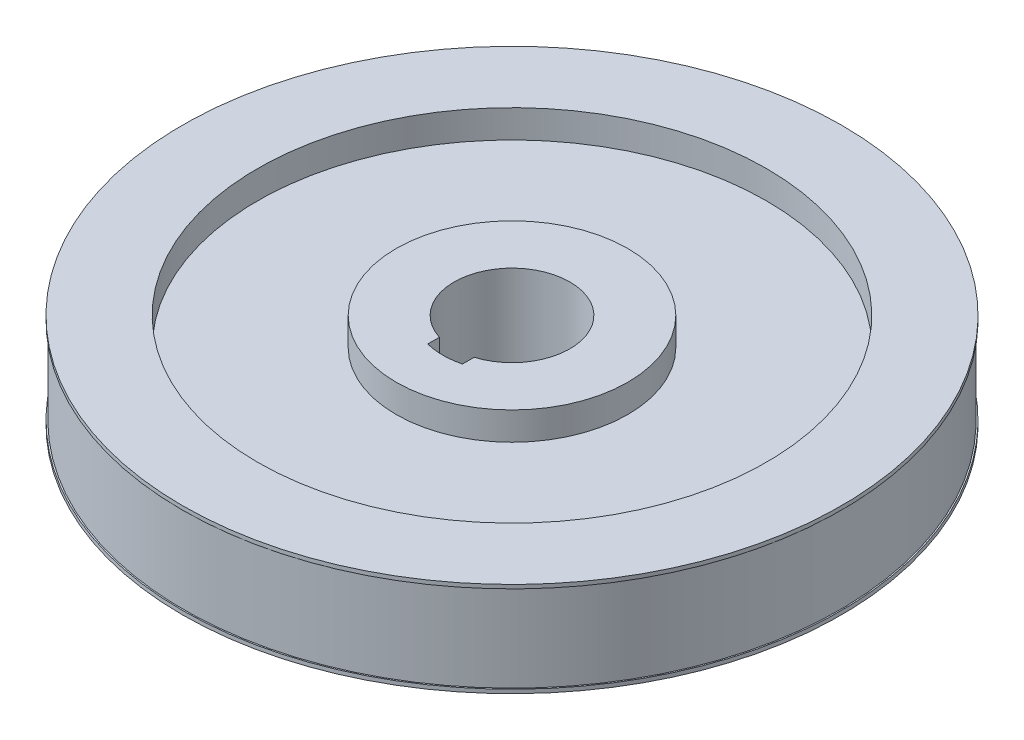
ISO-10303-21;
HEADER;
FILE_DESCRIPTION(('STEP AP214'),'2;1');
FILE_NAME('part.step','',(''),(''),'','','');
FILE_SCHEMA(('AUTOMOTIVE_DESIGN { 1 0 10303 214 1 1 1 1 }'));
ENDSEC;
DATA;
#1=APPLICATION_CONTEXT('core data for automotive mechanical design processes');
#2=APPLICATION_PROTOCOL_DEFINITION('international standard','automotive_design',2000,#1);
#3=PRODUCT_CONTEXT('',#1,'mechanical');
#4=PRODUCT('Part','Part','',(#3));
#5=PRODUCT_RELATED_PRODUCT_CATEGORY('part','',(#4));
#6=PRODUCT_DEFINITION_FORMATION('','',#4);
#7=PRODUCT_DEFINITION_CONTEXT('part definition',#1,'design');
#8=PRODUCT_DEFINITION('design','',#6,#7);
#9=PRODUCT_DEFINITION_SHAPE('','',#8);
#10=(LENGTH_UNIT() NAMED_UNIT(*) SI_UNIT(.MILLI.,.METRE.));
#11=(NAMED_UNIT(*) PLANE_ANGLE_UNIT() SI_UNIT($,.RADIAN.));
#12=(NAMED_UNIT(*) SI_UNIT($,.STERADIAN.) SOLID_ANGLE_UNIT());
#13=UNCERTAINTY_MEASURE_WITH_UNIT(LENGTH_MEASURE(1.E-05),#10,'distance_accuracy_value','');
#14=(GEOMETRIC_REPRESENTATION_CONTEXT(3) GLOBAL_UNCERTAINTY_ASSIGNED_CONTEXT((#13)) GLOBAL_UNIT_ASSIGNED_CONTEXT((#10,
#11,#12)) REPRESENTATION_CONTEXT('',''));
#15=CARTESIAN_POINT('',(0.,0.,0.));
#16=DIRECTION('',(0.,0.,1.));
#17=DIRECTION('',(1.,0.,0.));
#18=AXIS2_PLACEMENT_3D('',#15,#16,#17);
#19=CARTESIAN_POINT('',(0.,22.5,0.));
#20=DIRECTION('',(0.,-1.,0.));
#21=DIRECTION('',(0.,0.,-1.));
#22=AXIS2_PLACEMENT_3D('',#19,#20,#21);
#23=CYLINDRICAL_SURFACE('',#22,170.);
#24=CARTESIAN_POINT('',(0.,22.5,0.));
#25=DIRECTION('',(0.,1.,0.));
#26=DIRECTION('',(0.,0.,1.));
#27=AXIS2_PLACEMENT_3D('',#24,#25,#26);
#28=CIRCLE('',#27,170.);
#29=CARTESIAN_POINT('',(0.,22.5,-170.));
#30=VERTEX_POINT('',#29);
#31=EDGE_CURVE('E147',#30,#30,#28,.T.);
#32=CARTESIAN_POINT('',(0.,-22.5,0.));
#33=DIRECTION('',(0.,1.,0.));
#34=DIRECTION('',(0.,0.,1.));
#35=AXIS2_PLACEMENT_3D('',#32,#33,#34);
#36=CIRCLE('',#35,170.);
#37=CARTESIAN_POINT('',(0.,-22.5,-170.));
#38=VERTEX_POINT('',#37);
#39=EDGE_CURVE('E141',#38,#38,#36,.T.);
#40=CARTESIAN_POINT('',(0.,22.5,-170.));
#41=CARTESIAN_POINT('',(0.,22.03125,-170.));
#42=CARTESIAN_POINT('',(0.,21.5625,-170.));
#43=CARTESIAN_POINT('',(0.,20.625,-170.));
#44=CARTESIAN_POINT('',(0.,20.15625,-170.));
#45=CARTESIAN_POINT('',(0.,19.21875,-170.));
#46=CARTESIAN_POINT('',(0.,18.75,-170.));
#47=CARTESIAN_POINT('',(0.,17.8125,-170.));
#48=CARTESIAN_POINT('',(0.,17.34375,-170.));
#49=CARTESIAN_POINT('',(0.,16.40625,-170.));
#50=CARTESIAN_POINT('',(0.,15.9375,-170.));
#51=CARTESIAN_POINT('',(0.,15.,-170.));
#52=CARTESIAN_POINT('',(0.,14.53125,-170.));
#53=CARTESIAN_POINT('',(0.,13.59375,-170.));
#54=CARTESIAN_POINT('',(0.,13.125,-170.));
#55=CARTESIAN_POINT('',(0.,12.1875,-170.));
#56=CARTESIAN_POINT('',(0.,11.71875,-170.));
#57=CARTESIAN_POINT('',(0.,10.78125,-170.));
#58=CARTESIAN_POINT('',(0.,10.3125,-170.));
#59=CARTESIAN_POINT('',(0.,9.37499999999999,-170.));
#60=CARTESIAN_POINT('',(0.,8.90625,-170.));
#61=CARTESIAN_POINT('',(0.,7.96874999999999,-170.));
#62=CARTESIAN_POINT('',(0.,7.5,-170.));
#63=CARTESIAN_POINT('',(0.,6.5625,-170.));
#64=CARTESIAN_POINT('',(0.,6.09374999999999,-170.));
#65=CARTESIAN_POINT('',(0.,5.15624999999999,-170.));
#66=CARTESIAN_POINT('',(0.,4.68749999999999,-170.));
#67=CARTESIAN_POINT('',(0.,3.74999999999999,-170.));
#68=CARTESIAN_POINT('',(0.,3.28124999999999,-170.));
#69=CARTESIAN_POINT('',(0.,2.34375,-170.));
#70=CARTESIAN_POINT('',(0.,1.87499999999999,-170.));
#71=CARTESIAN_POINT('',(0.,0.937499999999994,-170.));
#72=CARTESIAN_POINT('',(0.,0.468749999999993,-170.));
#73=CARTESIAN_POINT('',(0.,-0.468750000000007,-170.));
#74=CARTESIAN_POINT('',(0.,-0.937500000000008,-170.));
#75=CARTESIAN_POINT('',(0.,-1.87500000000001,-170.));
#76=CARTESIAN_POINT('',(0.,-2.34375000000001,-170.));
#77=CARTESIAN_POINT('',(0.,-3.28125000000001,-170.));
#78=CARTESIAN_POINT('',(0.,-3.75000000000001,-170.));
#79=CARTESIAN_POINT('',(0.,-4.68750000000001,-170.));
#80=CARTESIAN_POINT('',(0.,-5.15625000000001,-170.));
#81=CARTESIAN_POINT('',(0.,-6.09375000000001,-170.));
#82=CARTESIAN_POINT('',(0.,-6.56250000000001,-170.));
#83=CARTESIAN_POINT('',(0.,-7.50000000000001,-170.));
#84=CARTESIAN_POINT('',(0.,-7.96875000000001,-170.));
#85=CARTESIAN_POINT('',(0.,-8.90625000000001,-170.));
#86=CARTESIAN_POINT('',(0.,-9.37500000000001,-170.));
#87=CARTESIAN_POINT('',(0.,-10.3125,-170.));
#88=CARTESIAN_POINT('',(0.,-10.78125,-170.));
#89=CARTESIAN_POINT('',(0.,-11.71875,-170.));
#90=CARTESIAN_POINT('',(0.,-12.1875,-170.));
#91=CARTESIAN_POINT('',(0.,-13.125,-170.));
#92=CARTESIAN_POINT('',(0.,-13.59375,-170.));
#93=CARTESIAN_POINT('',(0.,-14.53125,-170.));
#94=CARTESIAN_POINT('',(0.,-15.,-170.));
#95=CARTESIAN_POINT('',(0.,-15.9375,-170.));
#96=CARTESIAN_POINT('',(0.,-16.40625,-170.));
#97=CARTESIAN_POINT('',(0.,-17.34375,-170.));
#98=CARTESIAN_POINT('',(0.,-17.8125,-170.));
#99=CARTESIAN_POINT('',(0.,-18.75,-170.));
#100=CARTESIAN_POINT('',(0.,-19.21875,-170.));
#101=CARTESIAN_POINT('',(0.,-20.15625,-170.));
#102=CARTESIAN_POINT('',(0.,-20.625,-170.));
#103=CARTESIAN_POINT('',(0.,-21.5625,-170.));
#104=CARTESIAN_POINT('',(0.,-22.03125,-170.));
#105=CARTESIAN_POINT('',(0.,-22.5,-170.));
#106=B_SPLINE_CURVE_WITH_KNOTS('',3,(#40,#41,#42,#43,#44,#45,#46,#47,#48,#49,#50,#51,#52,#53,
#54,#55,#56,#57,#58,#59,#60,#61,#62,#63,#64,#65,#66,#67,#68,#69,#70,#71,#72,#73,#74,#75,#76,#77,
#78,#79,#80,#81,#82,#83,#84,#85,#86,#87,#88,#89,#90,#91,#92,#93,#94,#95,#96,#97,#98,#99,#100,
#101,#102,#103,#104,#105),.UNSPECIFIED.,.F.,.F.,(4,2,2,2,2,2,2,2,2,2,2,2,2,2,2,2,2,2,2,2,2,2,2,
2,2,2,2,2,2,2,2,2,4),(0.,1.40625,2.8125,4.21875,5.625,7.03125,8.4375,9.84375,11.25,12.65625,
14.0625,15.46875,16.875,18.28125,19.6875,21.09375,22.5,23.90625,25.3125,26.71875,28.125,
29.53125,30.9375,32.34375,33.75,35.15625,36.5625,37.96875,39.375,40.78125,42.1875,43.59375,45.),.UNSPECIFIED.);
#107=EDGE_CURVE('BSEAM43',#30,#38,#106,.T.);
#108=ORIENTED_EDGE('',*,*,#31,.F.);
#109=ORIENTED_EDGE('',*,*,#39,.T.);
#110=ORIENTED_EDGE('',*,*,#107,.T.);
#111=ORIENTED_EDGE('',*,*,#107,.F.);
#112=EDGE_LOOP('',(#108,#110,#109,#111));
#113=FACE_BOUND('',#112,.T.);
#114=ADVANCED_FACE('F43',(#113),#23,.T.);
#115=CARTESIAN_POINT('',(0.,24.5,0.));
#116=DIRECTION('',(0.,-1.,0.));
#117=DIRECTION('',(0.,0.,-1.));
#118=AXIS2_PLACEMENT_3D('',#115,#116,#117);
#119=CYLINDRICAL_SURFACE('',#118,170.69);
#120=CARTESIAN_POINT('',(0.,24.5,0.));
#121=DIRECTION('',(0.,1.,0.));
#122=DIRECTION('',(0.,0.,1.));
#123=AXIS2_PLACEMENT_3D('',#120,#121,#122);
#124=CIRCLE('',#123,170.69);
#125=CARTESIAN_POINT('',(0.,24.5,170.69));
#126=VERTEX_POINT('',#125);
#127=EDGE_CURVE('E144',#126,#126,#124,.T.);
#128=ORIENTED_EDGE('',*,*,#127,.F.);
#129=EDGE_LOOP('',(#128));
#130=FACE_BOUND('',#129,.T.);
#131=CARTESIAN_POINT('',(0.,22.5,0.));
#132=DIRECTION('',(0.,1.,0.));
#133=DIRECTION('',(0.,0.,1.));
#134=AXIS2_PLACEMENT_3D('',#131,#132,#133);
#135=CIRCLE('',#134,170.69);
#136=CARTESIAN_POINT('',(0.,22.5,170.69));
#137=VERTEX_POINT('',#136);
#138=EDGE_CURVE('E148',#137,#137,#135,.T.);
#139=ORIENTED_EDGE('',*,*,#138,.T.);
#140=EDGE_LOOP('',(#139));
#141=FACE_BOUND('',#140,.T.);
#142=ADVANCED_FACE('F172',(#130,#141),#119,.T.);
#143=CARTESIAN_POINT('',(0.,24.5,0.));
#144=DIRECTION('',(0.,1.,0.));
#145=DIRECTION('',(0.,0.,1.));
#146=AXIS2_PLACEMENT_3D('',#143,#144,#145);
#147=PLANE('',#146);
#148=CARTESIAN_POINT('',(0.,24.5,0.));
#149=DIRECTION('',(0.,1.,0.));
#150=DIRECTION('',(0.,0.,1.));
#151=AXIS2_PLACEMENT_3D('',#148,#149,#150);
#152=CIRCLE('',#151,131.78);
#153=CARTESIAN_POINT('',(0.,24.5,-131.78));
#154=VERTEX_POINT('',#153);
#155=EDGE_CURVE('E120',#154,#154,#152,.T.);
#156=ORIENTED_EDGE('',*,*,#155,.F.);
#157=EDGE_LOOP('',(#156));
#158=FACE_BOUND('',#157,.T.);
#159=ORIENTED_EDGE('',*,*,#127,.T.);
#160=EDGE_LOOP('',(#159));
#161=FACE_BOUND('',#160,.T.);
#162=ADVANCED_FACE('F177',(#158,#161),#147,.T.);
#163=CARTESIAN_POINT('',(0.,22.5,0.));
#164=DIRECTION('',(0.,1.,0.));
#165=DIRECTION('',(0.,0.,1.));
#166=AXIS2_PLACEMENT_3D('',#163,#164,#165);
#167=PLANE('',#166);
#168=ORIENTED_EDGE('',*,*,#31,.T.);
#169=EDGE_LOOP('',(#168));
#170=FACE_BOUND('',#169,.T.);
#171=ORIENTED_EDGE('',*,*,#138,.F.);
#172=EDGE_LOOP('',(#171));
#173=FACE_BOUND('',#172,.T.);
#174=ADVANCED_FACE('F193',(#170,#173),#167,.F.);
#175=CARTESIAN_POINT('',(0.,-24.5,0.));
#176=DIRECTION('',(0.,1.,0.));
#177=DIRECTION('',(0.,0.,1.));
#178=AXIS2_PLACEMENT_3D('',#175,#176,#177);
#179=CYLINDRICAL_SURFACE('',#178,170.69);
#180=CARTESIAN_POINT('',(0.,-24.5,0.));
#181=DIRECTION('',(0.,1.,0.));
#182=DIRECTION('',(0.,0.,1.));
#183=AXIS2_PLACEMENT_3D('',#180,#181,#182);
#184=CIRCLE('',#183,170.69);
#185=CARTESIAN_POINT('',(0.,-24.5,170.69));
#186=VERTEX_POINT('',#185);
#187=EDGE_CURVE('E138',#186,#186,#184,.T.);
#188=ORIENTED_EDGE('',*,*,#187,.T.);
#189=EDGE_LOOP('',(#188));
#190=FACE_BOUND('',#189,.T.);
#191=CARTESIAN_POINT('',(0.,-22.5,0.));
#192=DIRECTION('',(0.,1.,0.));
#193=DIRECTION('',(0.,0.,1.));
#194=AXIS2_PLACEMENT_3D('',#191,#192,#193);
#195=CIRCLE('',#194,170.69);
#196=CARTESIAN_POINT('',(0.,-22.5,170.69));
#197=VERTEX_POINT('',#196);
#198=EDGE_CURVE('E135',#197,#197,#195,.T.);
#199=ORIENTED_EDGE('',*,*,#198,.F.);
#200=EDGE_LOOP('',(#199));
#201=FACE_BOUND('',#200,.T.);
#202=ADVANCED_FACE('F191',(#190,#201),#179,.T.);
#203=CARTESIAN_POINT('',(0.,-24.5,0.));
#204=DIRECTION('',(0.,-1.,0.));
#205=DIRECTION('',(0.,0.,1.));
#206=AXIS2_PLACEMENT_3D('',#203,#204,#205);
#207=PLANE('',#206);
#208=CARTESIAN_POINT('',(0.,-24.5,0.));
#209=DIRECTION('',(0.,1.,0.));
#210=DIRECTION('',(0.,0.,1.));
#211=AXIS2_PLACEMENT_3D('',#208,#209,#210);
#212=CIRCLE('',#211,131.78);
#213=CARTESIAN_POINT('',(0.,-24.5,131.78));
#214=VERTEX_POINT('',#213);
#215=EDGE_CURVE('E132',#214,#214,#212,.T.);
#216=ORIENTED_EDGE('',*,*,#215,.T.);
#217=EDGE_LOOP('',(#216));
#218=FACE_BOUND('',#217,.T.);
#219=ORIENTED_EDGE('',*,*,#187,.F.);
#220=EDGE_LOOP('',(#219));
#221=FACE_BOUND('',#220,.T.);
#222=ADVANCED_FACE('F187',(#218,#221),#207,.T.);
#223=CARTESIAN_POINT('',(0.,-22.5,0.));
#224=DIRECTION('',(0.,-1.,0.));
#225=DIRECTION('',(0.,0.,1.));
#226=AXIS2_PLACEMENT_3D('',#223,#224,#225);
#227=PLANE('',#226);
#228=ORIENTED_EDGE('',*,*,#39,.F.);
#229=EDGE_LOOP('',(#228));
#230=FACE_BOUND('',#229,.T.);
#231=ORIENTED_EDGE('',*,*,#198,.T.);
#232=EDGE_LOOP('',(#231));
#233=FACE_BOUND('',#232,.T.);
#234=ADVANCED_FACE('F183',(#230,#233),#227,.F.);
#235=CARTESIAN_POINT('',(0.,-24.5,0.));
#236=DIRECTION('',(0.,1.,0.));
#237=DIRECTION('',(0.,0.,1.));
#238=AXIS2_PLACEMENT_3D('',#235,#236,#237);
#239=CYLINDRICAL_SURFACE('',#238,131.78);
#240=CARTESIAN_POINT('',(0.,-10.,0.));
#241=DIRECTION('',(0.,1.,0.));
#242=DIRECTION('',(0.,0.,1.));
#243=AXIS2_PLACEMENT_3D('',#240,#241,#242);
#244=CIRCLE('',#243,131.78);
#245=CARTESIAN_POINT('',(0.,-10.,131.78));
#246=VERTEX_POINT('',#245);
#247=EDGE_CURVE('E129',#246,#246,#244,.T.);
#248=CARTESIAN_POINT('',(0.,-24.5,131.78));
#249=CARTESIAN_POINT('',(0.,-24.3489583333333,131.78));
#250=CARTESIAN_POINT('',(0.,-24.1979166666667,131.78));
#251=CARTESIAN_POINT('',(0.,-23.8958333333333,131.78));
#252=CARTESIAN_POINT('',(0.,-23.7447916666667,131.78));
#253=CARTESIAN_POINT('',(0.,-23.4427083333333,131.78));
#254=CARTESIAN_POINT('',(0.,-23.2916666666667,131.78));
#255=CARTESIAN_POINT('',(0.,-22.9895833333333,131.78));
#256=CARTESIAN_POINT('',(0.,-22.8385416666667,131.78));
#257=CARTESIAN_POINT('',(0.,-22.5364583333333,131.78));
#258=CARTESIAN_POINT('',(0.,-22.3854166666667,131.78));
#259=CARTESIAN_POINT('',(0.,-22.0833333333333,131.78));
#260=CARTESIAN_POINT('',(0.,-21.9322916666667,131.78));
#261=CARTESIAN_POINT('',(0.,-21.6302083333333,131.78));
#262=CARTESIAN_POINT('',(0.,-21.4791666666667,131.78));
#263=CARTESIAN_POINT('',(0.,-21.1770833333333,131.78));
#264=CARTESIAN_POINT('',(0.,-21.0260416666667,131.78));
#265=CARTESIAN_POINT('',(0.,-20.7239583333333,131.78));
#266=CARTESIAN_POINT('',(0.,-20.5729166666667,131.78));
#267=CARTESIAN_POINT('',(0.,-20.2708333333333,131.78));
#268=CARTESIAN_POINT('',(0.,-20.1197916666667,131.78));
#269=CARTESIAN_POINT('',(0.,-19.8177083333333,131.78));
#270=CARTESIAN_POINT('',(0.,-19.6666666666667,131.78));
#271=CARTESIAN_POINT('',(0.,-19.3645833333333,131.78));
#272=CARTESIAN_POINT('',(0.,-19.2135416666667,131.78));
#273=CARTESIAN_POINT('',(0.,-18.9114583333333,131.78));
#274=CARTESIAN_POINT('',(0.,-18.7604166666667,131.78));
#275=CARTESIAN_POINT('',(0.,-18.4583333333333,131.78));
#276=CARTESIAN_POINT('',(0.,-18.3072916666667,131.78));
#277=CARTESIAN_POINT('',(0.,-18.0052083333333,131.78));
#278=CARTESIAN_POINT('',(0.,-17.8541666666667,131.78));
#279=CARTESIAN_POINT('',(0.,-17.5520833333333,131.78));
#280=CARTESIAN_POINT('',(0.,-17.4010416666667,131.78));
#281=CARTESIAN_POINT('',(0.,-17.0989583333333,131.78));
#282=CARTESIAN_POINT('',(0.,-16.9479166666667,131.78));
#283=CARTESIAN_POINT('',(0.,-16.6458333333333,131.78));
#284=CARTESIAN_POINT('',(0.,-16.4947916666667,131.78));
#285=CARTESIAN_POINT('',(0.,-16.1927083333333,131.78));
#286=CARTESIAN_POINT('',(0.,-16.0416666666667,131.78));
#287=CARTESIAN_POINT('',(0.,-15.7395833333333,131.78));
#288=CARTESIAN_POINT('',(0.,-15.5885416666667,131.78));
#289=CARTESIAN_POINT('',(0.,-15.2864583333333,131.78));
#290=CARTESIAN_POINT('',(0.,-15.1354166666667,131.78));
#291=CARTESIAN_POINT('',(0.,-14.8333333333333,131.78));
#292=CARTESIAN_POINT('',(0.,-14.6822916666667,131.78));
#293=CARTESIAN_POINT('',(0.,-14.3802083333333,131.78));
#294=CARTESIAN_POINT('',(0.,-14.2291666666667,131.78));
#295=CARTESIAN_POINT('',(0.,-13.9270833333333,131.78));
#296=CARTESIAN_POINT('',(0.,-13.7760416666667,131.78));
#297=CARTESIAN_POINT('',(0.,-13.4739583333333,131.78));
#298=CARTESIAN_POINT('',(0.,-13.3229166666667,131.78));
#299=CARTESIAN_POINT('',(0.,-13.0208333333333,131.78));
#300=CARTESIAN_POINT('',(0.,-12.8697916666667,131.78));
#301=CARTESIAN_POINT('',(0.,-12.5677083333333,131.78));
#302=CARTESIAN_POINT('',(0.,-12.4166666666667,131.78));
#303=CARTESIAN_POINT('',(0.,-12.1145833333333,131.78));
#304=CARTESIAN_POINT('',(0.,-11.9635416666667,131.78));
#305=CARTESIAN_POINT('',(0.,-11.6614583333333,131.78));
#306=CARTESIAN_POINT('',(0.,-11.5104166666667,131.78));
#307=CARTESIAN_POINT('',(0.,-11.2083333333333,131.78));
#308=CARTESIAN_POINT('',(0.,-11.0572916666667,131.78));
#309=CARTESIAN_POINT('',(0.,-10.7552083333333,131.78));
#310=CARTESIAN_POINT('',(0.,-10.6041666666667,131.78));
#311=CARTESIAN_POINT('',(0.,-10.3020833333333,131.78));
#312=CARTESIAN_POINT('',(0.,-10.1510416666667,131.78));
#313=CARTESIAN_POINT('',(0.,-10.,131.78));
#314=B_SPLINE_CURVE_WITH_KNOTS('',3,(#248,#249,#250,#251,#252,#253,#254,#255,#256,#257,#258,
#259,#260,#261,#262,#263,#264,#265,#266,#267,#268,#269,#270,#271,#272,#273,#274,#275,#276,#277,
#278,#279,#280,#281,#282,#283,#284,#285,#286,#287,#288,#289,#290,#291,#292,#293,#294,#295,#296,
#297,#298,#299,#300,#301,#302,#303,#304,#305,#306,#307,#308,#309,#310,#311,#312,#313),
.UNSPECIFIED.,.F.,.F.,(4,2,2,2,2,2,2,2,2,2,2,2,2,2,2,2,2,2,2,2,2,2,2,2,2,2,2,2,2,2,2,2,4),(0.,
0.453124999999999,0.906249999999997,1.359375,1.8125,2.265625,2.71875,3.171875,3.625,4.078125,
4.53125,4.984375,5.4375,5.890625,6.34375,6.796875,7.25,7.703125,8.15625,8.609375,9.0625,
9.515625,9.96875,10.421875,10.875,11.328125,11.78125,12.234375,12.6875,13.140625,13.59375,
14.046875,14.5),.UNSPECIFIED.);
#315=EDGE_CURVE('BSEAM186',#214,#246,#314,.T.);
#316=ORIENTED_EDGE('',*,*,#215,.F.);
#317=ORIENTED_EDGE('',*,*,#247,.T.);
#318=ORIENTED_EDGE('',*,*,#315,.T.);
#319=ORIENTED_EDGE('',*,*,#315,.F.);
#320=EDGE_LOOP('',(#316,#318,#317,#319));
#321=FACE_BOUND('',#320,.T.);
#322=ADVANCED_FACE('F186',(#321),#239,.F.);
#323=CARTESIAN_POINT('',(0.,-10.,0.));
#324=DIRECTION('',(0.,1.,0.));
#325=DIRECTION('',(0.,0.,1.));
#326=AXIS2_PLACEMENT_3D('',#323,#324,#325);
#327=PLANE('',#326);
#328=CARTESIAN_POINT('',(0.,-10.,0.));
#329=DIRECTION('',(0.,1.,0.));
#330=DIRECTION('',(0.,0.,1.));
#331=AXIS2_PLACEMENT_3D('',#328,#329,#330);
#332=CIRCLE('',#331,60.);
#333=CARTESIAN_POINT('',(0.,-10.,60.));
#334=VERTEX_POINT('',#333);
#335=EDGE_CURVE('E123',#334,#334,#332,.T.);
#336=ORIENTED_EDGE('',*,*,#335,.T.);
#337=EDGE_LOOP('',(#336));
#338=FACE_BOUND('',#337,.T.);
#339=ORIENTED_EDGE('',*,*,#247,.F.);
#340=EDGE_LOOP('',(#339));
#341=FACE_BOUND('',#340,.T.);
#342=ADVANCED_FACE('F236',(#338,#341),#327,.F.);
#343=CARTESIAN_POINT('',(0.,-24.5,0.));
#344=DIRECTION('',(0.,1.,0.));
#345=DIRECTION('',(0.,0.,1.));
#346=AXIS2_PLACEMENT_3D('',#343,#344,#345);
#347=CYLINDRICAL_SURFACE('',#346,60.);
#348=CARTESIAN_POINT('',(0.,-24.5,0.));
#349=DIRECTION('',(0.,1.,0.));
#350=DIRECTION('',(0.,0.,1.));
#351=AXIS2_PLACEMENT_3D('',#348,#349,#350);
#352=CIRCLE('',#351,60.);
#353=CARTESIAN_POINT('',(0.,-24.5,60.));
#354=VERTEX_POINT('',#353);
#355=EDGE_CURVE('E126',#354,#354,#352,.T.);
#356=CARTESIAN_POINT('',(0.,-24.5,60.));
#357=CARTESIAN_POINT('',(0.,-24.3489583333333,60.));
#358=CARTESIAN_POINT('',(0.,-24.1979166666667,60.));
#359=CARTESIAN_POINT('',(0.,-23.8958333333333,60.));
#360=CARTESIAN_POINT('',(0.,-23.7447916666667,60.));
#361=CARTESIAN_POINT('',(0.,-23.4427083333333,60.));
#362=CARTESIAN_POINT('',(0.,-23.2916666666667,60.));
#363=CARTESIAN_POINT('',(0.,-22.9895833333333,60.));
#364=CARTESIAN_POINT('',(0.,-22.8385416666667,60.));
#365=CARTESIAN_POINT('',(0.,-22.5364583333333,60.));
#366=CARTESIAN_POINT('',(0.,-22.3854166666667,60.));
#367=CARTESIAN_POINT('',(0.,-22.0833333333333,60.));
#368=CARTESIAN_POINT('',(0.,-21.9322916666667,60.));
#369=CARTESIAN_POINT('',(0.,-21.6302083333333,60.));
#370=CARTESIAN_POINT('',(0.,-21.4791666666667,60.));
#371=CARTESIAN_POINT('',(0.,-21.1770833333333,60.));
#372=CARTESIAN_POINT('',(0.,-21.0260416666667,60.));
#373=CARTESIAN_POINT('',(0.,-20.7239583333333,60.));
#374=CARTESIAN_POINT('',(0.,-20.5729166666667,60.));
#375=CARTESIAN_POINT('',(0.,-20.2708333333333,60.));
#376=CARTESIAN_POINT('',(0.,-20.1197916666667,60.));
#377=CARTESIAN_POINT('',(0.,-19.8177083333333,60.));
#378=CARTESIAN_POINT('',(0.,-19.6666666666667,60.));
#379=CARTESIAN_POINT('',(0.,-19.3645833333333,60.));
#380=CARTESIAN_POINT('',(0.,-19.2135416666667,60.));
#381=CARTESIAN_POINT('',(0.,-18.9114583333333,60.));
#382=CARTESIAN_POINT('',(0.,-18.7604166666667,60.));
#383=CARTESIAN_POINT('',(0.,-18.4583333333333,60.));
#384=CARTESIAN_POINT('',(0.,-18.3072916666667,60.));
#385=CARTESIAN_POINT('',(0.,-18.0052083333333,60.));
#386=CARTESIAN_POINT('',(0.,-17.8541666666667,60.));
#387=CARTESIAN_POINT('',(0.,-17.5520833333333,60.));
#388=CARTESIAN_POINT('',(0.,-17.4010416666667,60.));
#389=CARTESIAN_POINT('',(0.,-17.0989583333333,60.));
#390=CARTESIAN_POINT('',(0.,-16.9479166666667,60.));
#391=CARTESIAN_POINT('',(0.,-16.6458333333333,60.));
#392=CARTESIAN_POINT('',(0.,-16.4947916666667,60.));
#393=CARTESIAN_POINT('',(0.,-16.1927083333333,60.));
#394=CARTESIAN_POINT('',(0.,-16.0416666666667,60.));
#395=CARTESIAN_POINT('',(0.,-15.7395833333333,60.));
#396=CARTESIAN_POINT('',(0.,-15.5885416666667,60.));
#397=CARTESIAN_POINT('',(0.,-15.2864583333333,60.));
#398=CARTESIAN_POINT('',(0.,-15.1354166666667,60.));
#399=CARTESIAN_POINT('',(0.,-14.8333333333333,60.));
#400=CARTESIAN_POINT('',(0.,-14.6822916666667,60.));
#401=CARTESIAN_POINT('',(0.,-14.3802083333333,60.));
#402=CARTESIAN_POINT('',(0.,-14.2291666666667,60.));
#403=CARTESIAN_POINT('',(0.,-13.9270833333333,60.));
#404=CARTESIAN_POINT('',(0.,-13.7760416666667,60.));
#405=CARTESIAN_POINT('',(0.,-13.4739583333333,60.));
#406=CARTESIAN_POINT('',(0.,-13.3229166666667,60.));
#407=CARTESIAN_POINT('',(0.,-13.0208333333333,60.));
#408=CARTESIAN_POINT('',(0.,-12.8697916666667,60.));
#409=CARTESIAN_POINT('',(0.,-12.5677083333333,60.));
#410=CARTESIAN_POINT('',(0.,-12.4166666666667,60.));
#411=CARTESIAN_POINT('',(0.,-12.1145833333333,60.));
#412=CARTESIAN_POINT('',(0.,-11.9635416666667,60.));
#413=CARTESIAN_POINT('',(0.,-11.6614583333333,60.));
#414=CARTESIAN_POINT('',(0.,-11.5104166666667,60.));
#415=CARTESIAN_POINT('',(0.,-11.2083333333333,60.));
#416=CARTESIAN_POINT('',(0.,-11.0572916666667,60.));
#417=CARTESIAN_POINT('',(0.,-10.7552083333333,60.));
#418=CARTESIAN_POINT('',(0.,-10.6041666666667,60.));
#419=CARTESIAN_POINT('',(0.,-10.3020833333333,60.));
#420=CARTESIAN_POINT('',(0.,-10.1510416666667,60.));
#421=CARTESIAN_POINT('',(0.,-10.,60.));
#422=B_SPLINE_CURVE_WITH_KNOTS('',3,(#356,#357,#358,#359,#360,#361,#362,#363,#364,#365,#366,
#367,#368,#369,#370,#371,#372,#373,#374,#375,#376,#377,#378,#379,#380,#381,#382,#383,#384,#385,
#386,#387,#388,#389,#390,#391,#392,#393,#394,#395,#396,#397,#398,#399,#400,#401,#402,#403,#404,
#405,#406,#407,#408,#409,#410,#411,#412,#413,#414,#415,#416,#417,#418,#419,#420,#421),
.UNSPECIFIED.,.F.,.F.,(4,2,2,2,2,2,2,2,2,2,2,2,2,2,2,2,2,2,2,2,2,2,2,2,2,2,2,2,2,2,2,2,4),(0.,
0.453124999999999,0.906249999999997,1.359375,1.8125,2.265625,2.71875,3.171875,3.625,4.078125,
4.53125,4.984375,5.4375,5.890625,6.34375,6.796875,7.25,7.703125,8.15625,8.609375,9.0625,
9.515625,9.96875,10.421875,10.875,11.328125,11.78125,12.234375,12.6875,13.140625,13.59375,
14.046875,14.5),.UNSPECIFIED.);
#423=EDGE_CURVE('BSEAM234',#354,#334,#422,.T.);
#424=ORIENTED_EDGE('',*,*,#355,.T.);
#425=ORIENTED_EDGE('',*,*,#335,.F.);
#426=ORIENTED_EDGE('',*,*,#423,.T.);
#427=ORIENTED_EDGE('',*,*,#423,.F.);
#428=EDGE_LOOP('',(#424,#426,#425,#427));
#429=FACE_BOUND('',#428,.T.);
#430=ADVANCED_FACE('F234',(#429),#347,.T.);
#431=DIRECTION('',(0.,0.,1.));
#432=VECTOR('',#431,1.);
#433=CARTESIAN_POINT('',(9.,-24.5,34.6502525243323));
#434=LINE('',#433,#432);
#435=CARTESIAN_POINT('',(9.,-24.5,28.6181760425084));
#436=VERTEX_POINT('',#435);
#437=CARTESIAN_POINT('',(9.,-24.5,34.6502525243323));
#438=VERTEX_POINT('',#437);
#439=EDGE_CURVE('E100',#436,#438,#434,.T.);
#440=ORIENTED_EDGE('',*,*,#439,.F.);
#441=CARTESIAN_POINT('',(0.,-24.5,0.));
#442=DIRECTION('',(0.,-1.,0.));
#443=DIRECTION('',(0.,0.,-1.));
#444=AXIS2_PLACEMENT_3D('',#441,#442,#443);
#445=CIRCLE('',#444,30.);
#446=CARTESIAN_POINT('',(-9.,-24.5,28.6181760425084));
#447=VERTEX_POINT('',#446);
#448=EDGE_CURVE('E107',#447,#436,#445,.T.);
#449=ORIENTED_EDGE('',*,*,#448,.F.);
#450=DIRECTION('',(0.,0.,-1.));
#451=VECTOR('',#450,1.);
#452=CARTESIAN_POINT('',(-9.,-24.5,34.6502525243323));
#453=LINE('',#452,#451);
#454=CARTESIAN_POINT('',(-9.,-24.5,34.6502525243323));
#455=VERTEX_POINT('',#454);
#456=EDGE_CURVE('E57',#455,#447,#453,.T.);
#457=ORIENTED_EDGE('',*,*,#456,.F.);
#458=CARTESIAN_POINT('',(0.,-24.5,0.));
#459=DIRECTION('',(0.,-1.,0.));
#460=DIRECTION('',(0.,0.,-1.));
#461=AXIS2_PLACEMENT_3D('',#458,#459,#460);
#462=CIRCLE('',#461,35.8);
#463=EDGE_CURVE('E88',#438,#455,#462,.T.);
#464=ORIENTED_EDGE('',*,*,#463,.F.);
#465=EDGE_LOOP('',(#440,#449,#457,#464));
#466=FACE_BOUND('',#465,.T.);
#467=ORIENTED_EDGE('',*,*,#355,.F.);
#468=EDGE_LOOP('',(#467));
#469=FACE_BOUND('',#468,.T.);
#470=ADVANCED_FACE('F159',(#466,#469),#207,.T.);
#471=CARTESIAN_POINT('',(0.,10.,0.));
#472=DIRECTION('',(0.,-1.,0.));
#473=DIRECTION('',(0.,0.,1.));
#474=AXIS2_PLACEMENT_3D('',#471,#472,#473);
#475=PLANE('',#474);
#476=CARTESIAN_POINT('',(0.,10.,0.));
#477=DIRECTION('',(0.,1.,0.));
#478=DIRECTION('',(0.,0.,1.));
#479=AXIS2_PLACEMENT_3D('',#476,#477,#478);
#480=CIRCLE('',#479,131.78);
#481=CARTESIAN_POINT('',(0.,10.,-131.78));
#482=VERTEX_POINT('',#481);
#483=EDGE_CURVE('E117',#482,#482,#480,.T.);
#484=ORIENTED_EDGE('',*,*,#483,.T.);
#485=EDGE_LOOP('',(#484));
#486=FACE_BOUND('',#485,.T.);
#487=CARTESIAN_POINT('',(0.,10.,0.));
#488=DIRECTION('',(0.,1.,0.));
#489=DIRECTION('',(0.,0.,1.));
#490=AXIS2_PLACEMENT_3D('',#487,#488,#489);
#491=CIRCLE('',#490,60.);
#492=CARTESIAN_POINT('',(0.,10.,-60.));
#493=VERTEX_POINT('',#492);
#494=EDGE_CURVE('E111',#493,#493,#491,.T.);
#495=ORIENTED_EDGE('',*,*,#494,.F.);
#496=EDGE_LOOP('',(#495));
#497=FACE_BOUND('',#496,.T.);
#498=ADVANCED_FACE('F225',(#486,#497),#475,.F.);
#499=CARTESIAN_POINT('',(0.,24.5,0.));
#500=DIRECTION('',(0.,-1.,0.));
#501=DIRECTION('',(0.,0.,-1.));
#502=AXIS2_PLACEMENT_3D('',#499,#500,#501);
#503=CYLINDRICAL_SURFACE('',#502,131.78);
#504=CARTESIAN_POINT('',(0.,24.5,-131.78));
#505=CARTESIAN_POINT('',(0.,24.3489583333333,-131.78));
#506=CARTESIAN_POINT('',(0.,24.1979166666667,-131.78));
#507=CARTESIAN_POINT('',(0.,23.8958333333333,-131.78));
#508=CARTESIAN_POINT('',(0.,23.7447916666667,-131.78));
#509=CARTESIAN_POINT('',(0.,23.4427083333333,-131.78));
#510=CARTESIAN_POINT('',(0.,23.2916666666667,-131.78));
#511=CARTESIAN_POINT('',(0.,22.9895833333333,-131.78));
#512=CARTESIAN_POINT('',(0.,22.8385416666667,-131.78));
#513=CARTESIAN_POINT('',(0.,22.5364583333333,-131.78));
#514=CARTESIAN_POINT('',(0.,22.3854166666667,-131.78));
#515=CARTESIAN_POINT('',(0.,22.0833333333333,-131.78));
#516=CARTESIAN_POINT('',(0.,21.9322916666667,-131.78));
#517=CARTESIAN_POINT('',(0.,21.6302083333333,-131.78));
#518=CARTESIAN_POINT('',(0.,21.4791666666667,-131.78));
#519=CARTESIAN_POINT('',(0.,21.1770833333333,-131.78));
#520=CARTESIAN_POINT('',(0.,21.0260416666667,-131.78));
#521=CARTESIAN_POINT('',(0.,20.7239583333333,-131.78));
#522=CARTESIAN_POINT('',(0.,20.5729166666667,-131.78));
#523=CARTESIAN_POINT('',(0.,20.2708333333333,-131.78));
#524=CARTESIAN_POINT('',(0.,20.1197916666667,-131.78));
#525=CARTESIAN_POINT('',(0.,19.8177083333333,-131.78));
#526=CARTESIAN_POINT('',(0.,19.6666666666667,-131.78));
#527=CARTESIAN_POINT('',(0.,19.3645833333333,-131.78));
#528=CARTESIAN_POINT('',(0.,19.2135416666667,-131.78));
#529=CARTESIAN_POINT('',(0.,18.9114583333333,-131.78));
#530=CARTESIAN_POINT('',(0.,18.7604166666667,-131.78));
#531=CARTESIAN_POINT('',(0.,18.4583333333333,-131.78));
#532=CARTESIAN_POINT('',(0.,18.3072916666667,-131.78));
#533=CARTESIAN_POINT('',(0.,18.0052083333333,-131.78));
#534=CARTESIAN_POINT('',(0.,17.8541666666667,-131.78));
#535=CARTESIAN_POINT('',(0.,17.5520833333333,-131.78));
#536=CARTESIAN_POINT('',(0.,17.4010416666667,-131.78));
#537=CARTESIAN_POINT('',(0.,17.0989583333333,-131.78));
#538=CARTESIAN_POINT('',(0.,16.9479166666667,-131.78));
#539=CARTESIAN_POINT('',(0.,16.6458333333333,-131.78));
#540=CARTESIAN_POINT('',(0.,16.4947916666667,-131.78));
#541=CARTESIAN_POINT('',(0.,16.1927083333333,-131.78));
#542=CARTESIAN_POINT('',(0.,16.0416666666667,-131.78));
#543=CARTESIAN_POINT('',(0.,15.7395833333333,-131.78));
#544=CARTESIAN_POINT('',(0.,15.5885416666667,-131.78));
#545=CARTESIAN_POINT('',(0.,15.2864583333333,-131.78));
#546=CARTESIAN_POINT('',(0.,15.1354166666667,-131.78));
#547=CARTESIAN_POINT('',(0.,14.8333333333333,-131.78));
#548=CARTESIAN_POINT('',(0.,14.6822916666667,-131.78));
#549=CARTESIAN_POINT('',(0.,14.3802083333333,-131.78));
#550=CARTESIAN_POINT('',(0.,14.2291666666667,-131.78));
#551=CARTESIAN_POINT('',(0.,13.9270833333333,-131.78));
#552=CARTESIAN_POINT('',(0.,13.7760416666667,-131.78));
#553=CARTESIAN_POINT('',(0.,13.4739583333333,-131.78));
#554=CARTESIAN_POINT('',(0.,13.3229166666667,-131.78));
#555=CARTESIAN_POINT('',(0.,13.0208333333333,-131.78));
#556=CARTESIAN_POINT('',(0.,12.8697916666667,-131.78));
#557=CARTESIAN_POINT('',(0.,12.5677083333333,-131.78));
#558=CARTESIAN_POINT('',(0.,12.4166666666667,-131.78));
#559=CARTESIAN_POINT('',(0.,12.1145833333333,-131.78));
#560=CARTESIAN_POINT('',(0.,11.9635416666667,-131.78));
#561=CARTESIAN_POINT('',(0.,11.6614583333333,-131.78));
#562=CARTESIAN_POINT('',(0.,11.5104166666667,-131.78));
#563=CARTESIAN_POINT('',(0.,11.2083333333333,-131.78));
#564=CARTESIAN_POINT('',(0.,11.0572916666667,-131.78));
#565=CARTESIAN_POINT('',(0.,10.7552083333333,-131.78));
#566=CARTESIAN_POINT('',(0.,10.6041666666667,-131.78));
#567=CARTESIAN_POINT('',(0.,10.3020833333333,-131.78));
#568=CARTESIAN_POINT('',(0.,10.1510416666667,-131.78));
#569=CARTESIAN_POINT('',(0.,10.,-131.78));
#570=B_SPLINE_CURVE_WITH_KNOTS('',3,(#504,#505,#506,#507,#508,#509,#510,#511,#512,#513,#514,
#515,#516,#517,#518,#519,#520,#521,#522,#523,#524,#525,#526,#527,#528,#529,#530,#531,#532,#533,
#534,#535,#536,#537,#538,#539,#540,#541,#542,#543,#544,#545,#546,#547,#548,#549,#550,#551,#552,
#553,#554,#555,#556,#557,#558,#559,#560,#561,#562,#563,#564,#565,#566,#567,#568,#569),
.UNSPECIFIED.,.F.,.F.,(4,2,2,2,2,2,2,2,2,2,2,2,2,2,2,2,2,2,2,2,2,2,2,2,2,2,2,2,2,2,2,2,4),(0.,
0.453124999999999,0.906249999999997,1.359375,1.8125,2.265625,2.71875,3.171875,3.625,4.078125,
4.53125,4.984375,5.4375,5.890625,6.34375,6.796875,7.25,7.703125,8.15625,8.609375,9.0625,
9.515625,9.96875,10.421875,10.875,11.328125,11.78125,12.234375,12.6875,13.140625,13.59375,
14.046875,14.5),.UNSPECIFIED.);
#571=EDGE_CURVE('BSEAM219',#154,#482,#570,.T.);
#572=ORIENTED_EDGE('',*,*,#155,.T.);
#573=ORIENTED_EDGE('',*,*,#483,.F.);
#574=ORIENTED_EDGE('',*,*,#571,.T.);
#575=ORIENTED_EDGE('',*,*,#571,.F.);
#576=EDGE_LOOP('',(#572,#574,#573,#575));
#577=FACE_BOUND('',#576,.T.);
#578=ADVANCED_FACE('F219',(#577),#503,.F.);
#579=CARTESIAN_POINT('',(0.,24.5,0.));
#580=DIRECTION('',(0.,-1.,0.));
#581=DIRECTION('',(0.,0.,-1.));
#582=AXIS2_PLACEMENT_3D('',#579,#580,#581);
#583=CYLINDRICAL_SURFACE('',#582,60.);
#584=CARTESIAN_POINT('',(0.,24.5,0.));
#585=DIRECTION('',(0.,1.,0.));
#586=DIRECTION('',(0.,0.,1.));
#587=AXIS2_PLACEMENT_3D('',#584,#585,#586);
#588=CIRCLE('',#587,60.);
#589=CARTESIAN_POINT('',(0.,24.5,-60.));
#590=VERTEX_POINT('',#589);
#591=EDGE_CURVE('E114',#590,#590,#588,.T.);
#592=CARTESIAN_POINT('',(0.,24.5,-60.));
#593=CARTESIAN_POINT('',(0.,24.3489583333333,-60.));
#594=CARTESIAN_POINT('',(0.,24.1979166666667,-60.));
#595=CARTESIAN_POINT('',(0.,23.8958333333333,-60.));
#596=CARTESIAN_POINT('',(0.,23.7447916666667,-60.));
#597=CARTESIAN_POINT('',(0.,23.4427083333333,-60.));
#598=CARTESIAN_POINT('',(0.,23.2916666666667,-60.));
#599=CARTESIAN_POINT('',(0.,22.9895833333333,-60.));
#600=CARTESIAN_POINT('',(0.,22.8385416666667,-60.));
#601=CARTESIAN_POINT('',(0.,22.5364583333333,-60.));
#602=CARTESIAN_POINT('',(0.,22.3854166666667,-60.));
#603=CARTESIAN_POINT('',(0.,22.0833333333333,-60.));
#604=CARTESIAN_POINT('',(0.,21.9322916666667,-60.));
#605=CARTESIAN_POINT('',(0.,21.6302083333333,-60.));
#606=CARTESIAN_POINT('',(0.,21.4791666666667,-60.));
#607=CARTESIAN_POINT('',(0.,21.1770833333333,-60.));
#608=CARTESIAN_POINT('',(0.,21.0260416666667,-60.));
#609=CARTESIAN_POINT('',(0.,20.7239583333333,-60.));
#610=CARTESIAN_POINT('',(0.,20.5729166666667,-60.));
#611=CARTESIAN_POINT('',(0.,20.2708333333333,-60.));
#612=CARTESIAN_POINT('',(0.,20.1197916666667,-60.));
#613=CARTESIAN_POINT('',(0.,19.8177083333333,-60.));
#614=CARTESIAN_POINT('',(0.,19.6666666666667,-60.));
#615=CARTESIAN_POINT('',(0.,19.3645833333333,-60.));
#616=CARTESIAN_POINT('',(0.,19.2135416666667,-60.));
#617=CARTESIAN_POINT('',(0.,18.9114583333333,-60.));
#618=CARTESIAN_POINT('',(0.,18.7604166666667,-60.));
#619=CARTESIAN_POINT('',(0.,18.4583333333333,-60.));
#620=CARTESIAN_POINT('',(0.,18.3072916666667,-60.));
#621=CARTESIAN_POINT('',(0.,18.0052083333333,-60.));
#622=CARTESIAN_POINT('',(0.,17.8541666666667,-60.));
#623=CARTESIAN_POINT('',(0.,17.5520833333333,-60.));
#624=CARTESIAN_POINT('',(0.,17.4010416666667,-60.));
#625=CARTESIAN_POINT('',(0.,17.0989583333333,-60.));
#626=CARTESIAN_POINT('',(0.,16.9479166666667,-60.));
#627=CARTESIAN_POINT('',(0.,16.6458333333333,-60.));
#628=CARTESIAN_POINT('',(0.,16.4947916666667,-60.));
#629=CARTESIAN_POINT('',(0.,16.1927083333333,-60.));
#630=CARTESIAN_POINT('',(0.,16.0416666666667,-60.));
#631=CARTESIAN_POINT('',(0.,15.7395833333333,-60.));
#632=CARTESIAN_POINT('',(0.,15.5885416666667,-60.));
#633=CARTESIAN_POINT('',(0.,15.2864583333333,-60.));
#634=CARTESIAN_POINT('',(0.,15.1354166666667,-60.));
#635=CARTESIAN_POINT('',(0.,14.8333333333333,-60.));
#636=CARTESIAN_POINT('',(0.,14.6822916666667,-60.));
#637=CARTESIAN_POINT('',(0.,14.3802083333333,-60.));
#638=CARTESIAN_POINT('',(0.,14.2291666666667,-60.));
#639=CARTESIAN_POINT('',(0.,13.9270833333333,-60.));
#640=CARTESIAN_POINT('',(0.,13.7760416666667,-60.));
#641=CARTESIAN_POINT('',(0.,13.4739583333333,-60.));
#642=CARTESIAN_POINT('',(0.,13.3229166666667,-60.));
#643=CARTESIAN_POINT('',(0.,13.0208333333333,-60.));
#644=CARTESIAN_POINT('',(0.,12.8697916666667,-60.));
#645=CARTESIAN_POINT('',(0.,12.5677083333333,-60.));
#646=CARTESIAN_POINT('',(0.,12.4166666666667,-60.));
#647=CARTESIAN_POINT('',(0.,12.1145833333333,-60.));
#648=CARTESIAN_POINT('',(0.,11.9635416666667,-60.));
#649=CARTESIAN_POINT('',(0.,11.6614583333333,-60.));
#650=CARTESIAN_POINT('',(0.,11.5104166666667,-60.));
#651=CARTESIAN_POINT('',(0.,11.2083333333333,-60.));
#652=CARTESIAN_POINT('',(0.,11.0572916666667,-60.));
#653=CARTESIAN_POINT('',(0.,10.7552083333333,-60.));
#654=CARTESIAN_POINT('',(0.,10.6041666666667,-60.));
#655=CARTESIAN_POINT('',(0.,10.3020833333333,-60.));
#656=CARTESIAN_POINT('',(0.,10.1510416666667,-60.));
#657=CARTESIAN_POINT('',(0.,10.,-60.));
#658=B_SPLINE_CURVE_WITH_KNOTS('',3,(#592,#593,#594,#595,#596,#597,#598,#599,#600,#601,#602,
#603,#604,#605,#606,#607,#608,#609,#610,#611,#612,#613,#614,#615,#616,#617,#618,#619,#620,#621,
#622,#623,#624,#625,#626,#627,#628,#629,#630,#631,#632,#633,#634,#635,#636,#637,#638,#639,#640,
#641,#642,#643,#644,#645,#646,#647,#648,#649,#650,#651,#652,#653,#654,#655,#656,#657),
.UNSPECIFIED.,.F.,.F.,(4,2,2,2,2,2,2,2,2,2,2,2,2,2,2,2,2,2,2,2,2,2,2,2,2,2,2,2,2,2,2,2,4),(0.,
0.453125000000002,0.906250000000001,1.359375,1.8125,2.265625,2.71875,3.171875,3.625,4.078125,
4.53125,4.984375,5.4375,5.890625,6.34375,6.796875,7.25,7.703125,8.15625,8.609375,9.0625,
9.515625,9.96875,10.421875,10.875,11.328125,11.78125,12.234375,12.6875,13.140625,13.59375,
14.046875,14.5),.UNSPECIFIED.);
#659=EDGE_CURVE('BSEAM214',#590,#493,#658,.T.);
#660=ORIENTED_EDGE('',*,*,#591,.F.);
#661=ORIENTED_EDGE('',*,*,#494,.T.);
#662=ORIENTED_EDGE('',*,*,#659,.T.);
#663=ORIENTED_EDGE('',*,*,#659,.F.);
#664=EDGE_LOOP('',(#660,#662,#661,#663));
#665=FACE_BOUND('',#664,.T.);
#666=ADVANCED_FACE('F214',(#665),#583,.T.);
#667=DIRECTION('',(0.,0.,1.));
#668=VECTOR('',#667,1.);
#669=CARTESIAN_POINT('',(9.,24.5,34.6502525243323));
#670=LINE('',#669,#668);
#671=CARTESIAN_POINT('',(9.,24.5,28.6181760425084));
#672=VERTEX_POINT('',#671);
#673=CARTESIAN_POINT('',(9.,24.5,34.6502525243323));
#674=VERTEX_POINT('',#673);
#675=EDGE_CURVE('E90',#672,#674,#670,.T.);
#676=ORIENTED_EDGE('',*,*,#675,.T.);
#677=CARTESIAN_POINT('',(0.,24.5,0.));
#678=DIRECTION('',(0.,-1.,0.));
#679=DIRECTION('',(0.,0.,-1.));
#680=AXIS2_PLACEMENT_3D('',#677,#678,#679);
#681=CIRCLE('',#680,35.8);
#682=CARTESIAN_POINT('',(-9.,24.5,34.6502525243323));
#683=VERTEX_POINT('',#682);
#684=EDGE_CURVE('E85',#674,#683,#681,.T.);
#685=ORIENTED_EDGE('',*,*,#684,.T.);
#686=DIRECTION('',(0.,0.,-1.));
#687=VECTOR('',#686,1.);
#688=CARTESIAN_POINT('',(-9.,24.5,34.6502525243323));
#689=LINE('',#688,#687);
#690=CARTESIAN_POINT('',(-9.,24.5,28.6181760425084));
#691=VERTEX_POINT('',#690);
#692=EDGE_CURVE('E92',#683,#691,#689,.T.);
#693=ORIENTED_EDGE('',*,*,#692,.T.);
#694=CARTESIAN_POINT('',(0.,24.5,0.));
#695=DIRECTION('',(0.,-1.,0.));
#696=DIRECTION('',(0.,0.,-1.));
#697=AXIS2_PLACEMENT_3D('',#694,#695,#696);
#698=CIRCLE('',#697,30.);
#699=EDGE_CURVE('E109',#691,#672,#698,.T.);
#700=ORIENTED_EDGE('',*,*,#699,.T.);
#701=EDGE_LOOP('',(#676,#685,#693,#700));
#702=FACE_BOUND('',#701,.T.);
#703=ORIENTED_EDGE('',*,*,#591,.T.);
#704=EDGE_LOOP('',(#703));
#705=FACE_BOUND('',#704,.T.);
#706=ADVANCED_FACE('F98',(#702,#705),#147,.T.);
#707=CARTESIAN_POINT('',(0.,24.5,0.));
#708=DIRECTION('',(0.,-1.,0.));
#709=DIRECTION('',(0.,0.,-1.));
#710=AXIS2_PLACEMENT_3D('',#707,#708,#709);
#711=CYLINDRICAL_SURFACE('',#710,30.);
#712=ORIENTED_EDGE('',*,*,#448,.T.);
#713=DIRECTION('',(0.,-1.,0.));
#714=VECTOR('',#713,1.);
#715=CARTESIAN_POINT('',(9.,24.5,28.6181760425084));
#716=LINE('',#715,#714);
#717=EDGE_CURVE('E11',#436,#672,#716,.F.);
#718=ORIENTED_EDGE('',*,*,#717,.T.);
#719=ORIENTED_EDGE('',*,*,#699,.F.);
#720=DIRECTION('',(0.,-1.,0.));
#721=VECTOR('',#720,1.);
#722=CARTESIAN_POINT('',(-9.,24.5,28.6181760425084));
#723=LINE('',#722,#721);
#724=EDGE_CURVE('E50',#691,#447,#723,.T.);
#725=ORIENTED_EDGE('',*,*,#724,.T.);
#726=EDGE_LOOP('',(#712,#718,#719,#725));
#727=FACE_BOUND('',#726,.T.);
#728=ADVANCED_FACE('F156',(#727),#711,.F.);
#729=CARTESIAN_POINT('',(9.,24.5,34.6502525243323));
#730=DIRECTION('',(1.,0.,0.));
#731=DIRECTION('',(0.,0.,-1.));
#732=AXIS2_PLACEMENT_3D('',#729,#730,#731);
#733=PLANE('',#732);
#734=ORIENTED_EDGE('',*,*,#439,.T.);
#735=DIRECTION('',(0.,-1.,0.));
#736=VECTOR('',#735,1.);
#737=CARTESIAN_POINT('',(9.,24.5,34.6502525243323));
#738=LINE('',#737,#736);
#739=EDGE_CURVE('E89',#674,#438,#738,.T.);
#740=ORIENTED_EDGE('',*,*,#739,.F.);
#741=ORIENTED_EDGE('',*,*,#675,.F.);
#742=ORIENTED_EDGE('',*,*,#717,.F.);
#743=EDGE_LOOP('',(#734,#740,#741,#742));
#744=FACE_BOUND('',#743,.T.);
#745=ADVANCED_FACE('F162',(#744),#733,.F.);
#746=CARTESIAN_POINT('',(-9.,24.5,34.6502525243323));
#747=DIRECTION('',(-1.,0.,0.));
#748=DIRECTION('',(0.,0.,1.));
#749=AXIS2_PLACEMENT_3D('',#746,#747,#748);
#750=PLANE('',#749);
#751=ORIENTED_EDGE('',*,*,#692,.F.);
#752=DIRECTION('',(0.,-1.,0.));
#753=VECTOR('',#752,1.);
#754=CARTESIAN_POINT('',(-9.,24.5,34.6502525243323));
#755=LINE('',#754,#753);
#756=EDGE_CURVE('E81',#683,#455,#755,.T.);
#757=ORIENTED_EDGE('',*,*,#756,.T.);
#758=ORIENTED_EDGE('',*,*,#456,.T.);
#759=ORIENTED_EDGE('',*,*,#724,.F.);
#760=EDGE_LOOP('',(#751,#757,#758,#759));
#761=FACE_BOUND('',#760,.T.);
#762=ADVANCED_FACE('F93',(#761),#750,.F.);
#763=CARTESIAN_POINT('',(0.,24.5,0.));
#764=DIRECTION('',(0.,-1.,0.));
#765=DIRECTION('',(0.,0.,-1.));
#766=AXIS2_PLACEMENT_3D('',#763,#764,#765);
#767=CYLINDRICAL_SURFACE('',#766,35.8);
#768=ORIENTED_EDGE('',*,*,#463,.T.);
#769=ORIENTED_EDGE('',*,*,#756,.F.);
#770=ORIENTED_EDGE('',*,*,#684,.F.);
#771=ORIENTED_EDGE('',*,*,#739,.T.);
#772=EDGE_LOOP('',(#768,#769,#770,#771));
#773=FACE_BOUND('',#772,.T.);
#774=ADVANCED_FACE('F82',(#773),#767,.F.);
#775=CLOSED_SHELL('',(#114,#142,#162,#174,#202,#222,#234,#322,#342,#430,#470,#498,#578,#666,
#706,#728,#745,#762,#774));
#776=MANIFOLD_SOLID_BREP('B2',#775);
#777=ADVANCED_BREP_SHAPE_REPRESENTATION('',(#18,#776),#14);
#778=SHAPE_DEFINITION_REPRESENTATION(#9,#777);
ENDSEC;
END-ISO-10303-21;
